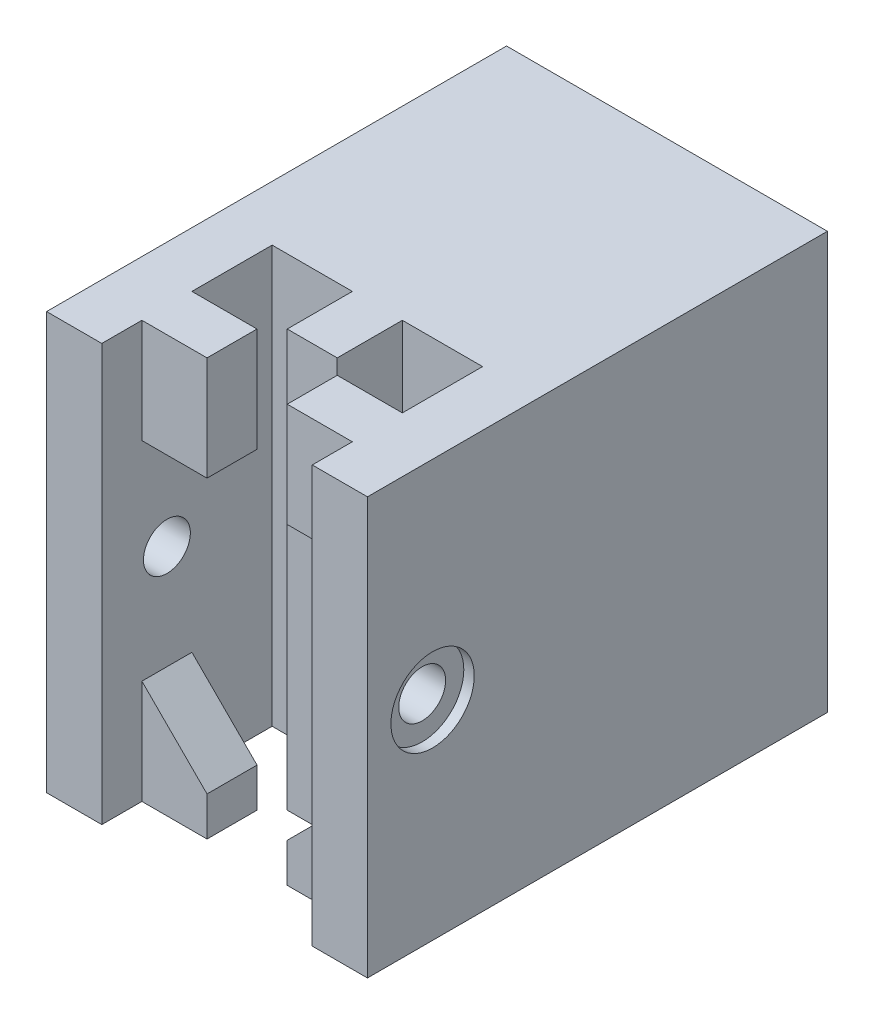
ISO-10303-21;
HEADER;
FILE_DESCRIPTION(('STEP AP214'),'2;1');
FILE_NAME('part.step','',(''),(''),'','','');
FILE_SCHEMA(('AUTOMOTIVE_DESIGN { 1 0 10303 214 1 1 1 1 }'));
ENDSEC;
DATA;
#1=APPLICATION_CONTEXT('core data for automotive mechanical design processes');
#2=APPLICATION_PROTOCOL_DEFINITION('international standard','automotive_design',2000,#1);
#3=PRODUCT_CONTEXT('',#1,'mechanical');
#4=PRODUCT('Part','Part','',(#3));
#5=PRODUCT_RELATED_PRODUCT_CATEGORY('part','',(#4));
#6=PRODUCT_DEFINITION_FORMATION('','',#4);
#7=PRODUCT_DEFINITION_CONTEXT('part definition',#1,'design');
#8=PRODUCT_DEFINITION('design','',#6,#7);
#9=PRODUCT_DEFINITION_SHAPE('','',#8);
#10=(LENGTH_UNIT() NAMED_UNIT(*) SI_UNIT(.MILLI.,.METRE.));
#11=(NAMED_UNIT(*) PLANE_ANGLE_UNIT() SI_UNIT($,.RADIAN.));
#12=(NAMED_UNIT(*) SI_UNIT($,.STERADIAN.) SOLID_ANGLE_UNIT());
#13=UNCERTAINTY_MEASURE_WITH_UNIT(LENGTH_MEASURE(1.E-05),#10,'distance_accuracy_value','');
#14=(GEOMETRIC_REPRESENTATION_CONTEXT(3) GLOBAL_UNCERTAINTY_ASSIGNED_CONTEXT((#13)) GLOBAL_UNIT_ASSIGNED_CONTEXT((#10,
#11,#12)) REPRESENTATION_CONTEXT('',''));
#15=CARTESIAN_POINT('',(0.,0.,0.));
#16=DIRECTION('',(0.,0.,1.));
#17=DIRECTION('',(1.,0.,0.));
#18=AXIS2_PLACEMENT_3D('',#15,#16,#17);
#19=CARTESIAN_POINT('',(-3.85,20.,2.4));
#20=DIRECTION('',(0.,0.,-1.));
#21=DIRECTION('',(-1.,0.,0.));
#22=AXIS2_PLACEMENT_3D('',#19,#20,#21);
#23=PLANE('',#22);
#24=DIRECTION('',(0.,-1.,0.));
#25=VECTOR('',#24,1.);
#26=CARTESIAN_POINT('',(-3.85,20.,2.4));
#27=LINE('',#26,#25);
#28=CARTESIAN_POINT('',(-3.85,-16.25,2.4));
#29=VERTEX_POINT('',#28);
#30=CARTESIAN_POINT('',(-3.85,-20.,2.4));
#31=VERTEX_POINT('',#30);
#32=EDGE_CURVE('E484',#29,#31,#27,.T.);
#33=ORIENTED_EDGE('',*,*,#32,.F.);
#34=DIRECTION('',(0.707106781186547,-0.707106781186548,0.));
#35=VECTOR('',#34,1.);
#36=CARTESIAN_POINT('',(-3.85,-16.25,2.4));
#37=LINE('',#36,#35);
#38=CARTESIAN_POINT('',(-10.1,-10.,2.4));
#39=VERTEX_POINT('',#38);
#40=EDGE_CURVE('E46',#29,#39,#37,.F.);
#41=ORIENTED_EDGE('',*,*,#40,.T.);
#42=DIRECTION('',(0.,-1.,0.));
#43=VECTOR('',#42,1.);
#44=CARTESIAN_POINT('',(-10.1,20.,2.4));
#45=LINE('',#44,#43);
#46=CARTESIAN_POINT('',(-10.1,-20.,2.4));
#47=VERTEX_POINT('',#46);
#48=EDGE_CURVE('E382',#39,#47,#45,.T.);
#49=ORIENTED_EDGE('',*,*,#48,.T.);
#50=DIRECTION('',(1.,0.,0.));
#51=VECTOR('',#50,1.);
#52=CARTESIAN_POINT('',(-3.85,-20.,2.4));
#53=LINE('',#52,#51);
#54=EDGE_CURVE('E341',#47,#31,#53,.T.);
#55=ORIENTED_EDGE('',*,*,#54,.T.);
#56=EDGE_LOOP('',(#33,#41,#49,#55));
#57=FACE_BOUND('',#56,.T.);
#58=ADVANCED_FACE('F37',(#57),#23,.F.);
#59=CARTESIAN_POINT('',(-3.85,20.,2.4));
#60=DIRECTION('',(-1.,0.,0.));
#61=DIRECTION('',(0.,0.,1.));
#62=AXIS2_PLACEMENT_3D('',#59,#60,#61);
#63=PLANE('',#62);
#64=DIRECTION('',(0.,-1.,0.));
#65=VECTOR('',#64,1.);
#66=CARTESIAN_POINT('',(-3.85,20.,-2.4));
#67=LINE('',#66,#65);
#68=CARTESIAN_POINT('',(-3.85,-16.25,-2.4));
#69=VERTEX_POINT('',#68);
#70=CARTESIAN_POINT('',(-3.85,-20.,-2.4));
#71=VERTEX_POINT('',#70);
#72=EDGE_CURVE('E480',#69,#71,#67,.T.);
#73=ORIENTED_EDGE('',*,*,#72,.F.);
#74=DIRECTION('',(0.,0.,1.));
#75=VECTOR('',#74,1.);
#76=CARTESIAN_POINT('',(-3.85,-16.25,2.4));
#77=LINE('',#76,#75);
#78=EDGE_CURVE('E499',#69,#29,#77,.T.);
#79=ORIENTED_EDGE('',*,*,#78,.T.);
#80=ORIENTED_EDGE('',*,*,#32,.T.);
#81=DIRECTION('',(0.,0.,-1.));
#82=VECTOR('',#81,1.);
#83=CARTESIAN_POINT('',(-3.85,-20.,2.4));
#84=LINE('',#83,#82);
#85=EDGE_CURVE('E385',#31,#71,#84,.T.);
#86=ORIENTED_EDGE('',*,*,#85,.T.);
#87=EDGE_LOOP('',(#73,#79,#80,#86));
#88=FACE_BOUND('',#87,.T.);
#89=ADVANCED_FACE('F514',(#88),#63,.F.);
#90=CARTESIAN_POINT('',(-3.85,20.,-2.4));
#91=DIRECTION('',(0.,0.,1.));
#92=DIRECTION('',(1.,0.,0.));
#93=AXIS2_PLACEMENT_3D('',#90,#91,#92);
#94=PLANE('',#93);
#95=DIRECTION('',(0.,-1.,0.));
#96=VECTOR('',#95,1.);
#97=CARTESIAN_POINT('',(-10.1,20.,-2.4));
#98=LINE('',#97,#96);
#99=CARTESIAN_POINT('',(-10.1,-10.,-2.4));
#100=VERTEX_POINT('',#99);
#101=CARTESIAN_POINT('',(-10.1,-20.,-2.4));
#102=VERTEX_POINT('',#101);
#103=EDGE_CURVE('E476',#100,#102,#98,.T.);
#104=ORIENTED_EDGE('',*,*,#103,.F.);
#105=DIRECTION('',(-0.707106781186547,0.707106781186548,0.));
#106=VECTOR('',#105,1.);
#107=CARTESIAN_POINT('',(-3.85,-16.25,-2.4));
#108=LINE('',#107,#106);
#109=EDGE_CURVE('E11',#100,#69,#108,.F.);
#110=ORIENTED_EDGE('',*,*,#109,.T.);
#111=ORIENTED_EDGE('',*,*,#72,.T.);
#112=DIRECTION('',(-1.,0.,0.));
#113=VECTOR('',#112,1.);
#114=CARTESIAN_POINT('',(-3.85,-20.,-2.4));
#115=LINE('',#114,#113);
#116=EDGE_CURVE('E388',#71,#102,#115,.T.);
#117=ORIENTED_EDGE('',*,*,#116,.T.);
#118=EDGE_LOOP('',(#104,#110,#111,#117));
#119=FACE_BOUND('',#118,.T.);
#120=ADVANCED_FACE('F512',(#119),#94,.F.);
#121=CARTESIAN_POINT('',(3.85,20.,-2.4));
#122=DIRECTION('',(0.,0.,1.));
#123=DIRECTION('',(1.,0.,0.));
#124=AXIS2_PLACEMENT_3D('',#121,#122,#123);
#125=PLANE('',#124);
#126=DIRECTION('',(0.,-1.,0.));
#127=VECTOR('',#126,1.);
#128=CARTESIAN_POINT('',(3.85,20.,-2.4));
#129=LINE('',#128,#127);
#130=CARTESIAN_POINT('',(3.85,-16.25,-2.4));
#131=VERTEX_POINT('',#130);
#132=CARTESIAN_POINT('',(3.85,-20.,-2.4));
#133=VERTEX_POINT('',#132);
#134=EDGE_CURVE('E450',#131,#133,#129,.T.);
#135=ORIENTED_EDGE('',*,*,#134,.F.);
#136=DIRECTION('',(-0.707106781186549,-0.707106781186546,0.));
#137=VECTOR('',#136,1.);
#138=CARTESIAN_POINT('',(3.85,-16.25,-2.4));
#139=LINE('',#138,#137);
#140=CARTESIAN_POINT('',(10.1,-10.,-2.4));
#141=VERTEX_POINT('',#140);
#142=EDGE_CURVE('E495',#131,#141,#139,.F.);
#143=ORIENTED_EDGE('',*,*,#142,.T.);
#144=DIRECTION('',(0.,-1.,0.));
#145=VECTOR('',#144,1.);
#146=CARTESIAN_POINT('',(10.1,20.,-2.4));
#147=LINE('',#146,#145);
#148=CARTESIAN_POINT('',(10.1,-20.,-2.4));
#149=VERTEX_POINT('',#148);
#150=EDGE_CURVE('E454',#141,#149,#147,.T.);
#151=ORIENTED_EDGE('',*,*,#150,.T.);
#152=DIRECTION('',(-1.,0.,0.));
#153=VECTOR('',#152,1.);
#154=CARTESIAN_POINT('',(3.85,-20.,-2.4));
#155=LINE('',#154,#153);
#156=EDGE_CURVE('E406',#149,#133,#155,.T.);
#157=ORIENTED_EDGE('',*,*,#156,.T.);
#158=EDGE_LOOP('',(#135,#143,#151,#157));
#159=FACE_BOUND('',#158,.T.);
#160=ADVANCED_FACE('F598',(#159),#125,.F.);
#161=CARTESIAN_POINT('',(3.85,20.,2.4));
#162=DIRECTION('',(1.,0.,0.));
#163=DIRECTION('',(0.,0.,-1.));
#164=AXIS2_PLACEMENT_3D('',#161,#162,#163);
#165=PLANE('',#164);
#166=DIRECTION('',(0.,-1.,0.));
#167=VECTOR('',#166,1.);
#168=CARTESIAN_POINT('',(3.85,20.,2.4));
#169=LINE('',#168,#167);
#170=CARTESIAN_POINT('',(3.85,-16.25,2.4));
#171=VERTEX_POINT('',#170);
#172=CARTESIAN_POINT('',(3.85,-20.,2.4));
#173=VERTEX_POINT('',#172);
#174=EDGE_CURVE('E446',#171,#173,#169,.T.);
#175=ORIENTED_EDGE('',*,*,#174,.F.);
#176=DIRECTION('',(0.,0.,-1.));
#177=VECTOR('',#176,1.);
#178=CARTESIAN_POINT('',(3.85,-16.25,2.4));
#179=LINE('',#178,#177);
#180=EDGE_CURVE('E488',#171,#131,#179,.T.);
#181=ORIENTED_EDGE('',*,*,#180,.T.);
#182=ORIENTED_EDGE('',*,*,#134,.T.);
#183=DIRECTION('',(0.,0.,1.));
#184=VECTOR('',#183,1.);
#185=CARTESIAN_POINT('',(3.85,-20.,2.4));
#186=LINE('',#185,#184);
#187=EDGE_CURVE('E409',#133,#173,#186,.T.);
#188=ORIENTED_EDGE('',*,*,#187,.T.);
#189=EDGE_LOOP('',(#175,#181,#182,#188));
#190=FACE_BOUND('',#189,.T.);
#191=ADVANCED_FACE('F594',(#190),#165,.F.);
#192=CARTESIAN_POINT('',(3.85,20.,2.4));
#193=DIRECTION('',(0.,0.,-1.));
#194=DIRECTION('',(-1.,0.,0.));
#195=AXIS2_PLACEMENT_3D('',#192,#193,#194);
#196=PLANE('',#195);
#197=DIRECTION('',(0.,-1.,0.));
#198=VECTOR('',#197,1.);
#199=CARTESIAN_POINT('',(10.1,20.,2.4));
#200=LINE('',#199,#198);
#201=CARTESIAN_POINT('',(10.1,-10.,2.4));
#202=VERTEX_POINT('',#201);
#203=CARTESIAN_POINT('',(10.1,-20.,2.4));
#204=VERTEX_POINT('',#203);
#205=EDGE_CURVE('E442',#202,#204,#200,.T.);
#206=ORIENTED_EDGE('',*,*,#205,.F.);
#207=DIRECTION('',(0.707106781186549,0.707106781186546,0.));
#208=VECTOR('',#207,1.);
#209=CARTESIAN_POINT('',(3.85,-16.25,2.4));
#210=LINE('',#209,#208);
#211=EDGE_CURVE('E497',#202,#171,#210,.F.);
#212=ORIENTED_EDGE('',*,*,#211,.T.);
#213=ORIENTED_EDGE('',*,*,#174,.T.);
#214=DIRECTION('',(1.,0.,0.));
#215=VECTOR('',#214,1.);
#216=CARTESIAN_POINT('',(3.85,-20.,2.4));
#217=LINE('',#216,#215);
#218=EDGE_CURVE('E412',#173,#204,#217,.T.);
#219=ORIENTED_EDGE('',*,*,#218,.T.);
#220=EDGE_LOOP('',(#206,#212,#213,#219));
#221=FACE_BOUND('',#220,.T.);
#222=ADVANCED_FACE('F588',(#221),#196,.F.);
#223=CARTESIAN_POINT('',(-10.1,20.,2.4));
#224=VERTEX_POINT('',#223);
#225=CARTESIAN_POINT('',(-10.1,10.,2.4));
#226=VERTEX_POINT('',#225);
#227=EDGE_CURVE('E427',#224,#226,#45,.T.);
#228=ORIENTED_EDGE('',*,*,#227,.T.);
#229=DIRECTION('',(1.,0.,0.));
#230=VECTOR('',#229,1.);
#231=CARTESIAN_POINT('',(-3.85,10.,2.4));
#232=LINE('',#231,#230);
#233=CARTESIAN_POINT('',(-3.85,10.,2.4));
#234=VERTEX_POINT('',#233);
#235=EDGE_CURVE('E320',#226,#234,#232,.T.);
#236=ORIENTED_EDGE('',*,*,#235,.T.);
#237=CARTESIAN_POINT('',(-3.85,20.,2.4));
#238=VERTEX_POINT('',#237);
#239=EDGE_CURVE('E485',#238,#234,#27,.T.);
#240=ORIENTED_EDGE('',*,*,#239,.F.);
#241=DIRECTION('',(1.,0.,0.));
#242=VECTOR('',#241,1.);
#243=CARTESIAN_POINT('',(-3.85,20.,2.4));
#244=LINE('',#243,#242);
#245=EDGE_CURVE('E342',#224,#238,#244,.T.);
#246=ORIENTED_EDGE('',*,*,#245,.F.);
#247=EDGE_LOOP('',(#228,#236,#240,#246));
#248=FACE_BOUND('',#247,.T.);
#249=ADVANCED_FACE('F545',(#248),#23,.F.);
#250=ORIENTED_EDGE('',*,*,#239,.T.);
#251=DIRECTION('',(0.,0.,-1.));
#252=VECTOR('',#251,1.);
#253=CARTESIAN_POINT('',(-3.85,10.,2.4));
#254=LINE('',#253,#252);
#255=CARTESIAN_POINT('',(-3.85,10.,-2.4));
#256=VERTEX_POINT('',#255);
#257=EDGE_CURVE('E317',#234,#256,#254,.T.);
#258=ORIENTED_EDGE('',*,*,#257,.T.);
#259=CARTESIAN_POINT('',(-3.85,20.,-2.4));
#260=VERTEX_POINT('',#259);
#261=EDGE_CURVE('E481',#260,#256,#67,.T.);
#262=ORIENTED_EDGE('',*,*,#261,.F.);
#263=DIRECTION('',(0.,0.,-1.));
#264=VECTOR('',#263,1.);
#265=CARTESIAN_POINT('',(-3.85,20.,2.4));
#266=LINE('',#265,#264);
#267=EDGE_CURVE('E345',#238,#260,#266,.T.);
#268=ORIENTED_EDGE('',*,*,#267,.F.);
#269=EDGE_LOOP('',(#250,#258,#262,#268));
#270=FACE_BOUND('',#269,.T.);
#271=ADVANCED_FACE('F541',(#270),#63,.F.);
#272=ORIENTED_EDGE('',*,*,#261,.T.);
#273=DIRECTION('',(-1.,0.,0.));
#274=VECTOR('',#273,1.);
#275=CARTESIAN_POINT('',(-3.85,10.,-2.4));
#276=LINE('',#275,#274);
#277=CARTESIAN_POINT('',(-10.1,10.,-2.4));
#278=VERTEX_POINT('',#277);
#279=EDGE_CURVE('E314',#256,#278,#276,.T.);
#280=ORIENTED_EDGE('',*,*,#279,.T.);
#281=CARTESIAN_POINT('',(-10.1,20.,-2.4));
#282=VERTEX_POINT('',#281);
#283=EDGE_CURVE('E477',#282,#278,#98,.T.);
#284=ORIENTED_EDGE('',*,*,#283,.F.);
#285=DIRECTION('',(-1.,0.,0.));
#286=VECTOR('',#285,1.);
#287=CARTESIAN_POINT('',(-3.85,20.,-2.4));
#288=LINE('',#287,#286);
#289=EDGE_CURVE('E348',#260,#282,#288,.T.);
#290=ORIENTED_EDGE('',*,*,#289,.F.);
#291=EDGE_LOOP('',(#272,#280,#284,#290));
#292=FACE_BOUND('',#291,.T.);
#293=ADVANCED_FACE('F536',(#292),#94,.F.);
#294=CARTESIAN_POINT('',(-10.1,20.,-10.1));
#295=DIRECTION('',(0.,0.,-1.));
#296=DIRECTION('',(-1.,0.,0.));
#297=AXIS2_PLACEMENT_3D('',#294,#295,#296);
#298=PLANE('',#297);
#299=DIRECTION('',(1.,0.,0.));
#300=VECTOR('',#299,1.);
#301=CARTESIAN_POINT('',(-10.1,-20.,-10.1));
#302=LINE('',#301,#300);
#303=CARTESIAN_POINT('',(-10.1,-20.,-10.1));
#304=VERTEX_POINT('',#303);
#305=CARTESIAN_POINT('',(-2.4,-20.,-10.1));
#306=VERTEX_POINT('',#305);
#307=EDGE_CURVE('E393',#304,#306,#302,.T.);
#308=ORIENTED_EDGE('',*,*,#307,.T.);
#309=DIRECTION('',(0.,-1.,0.));
#310=VECTOR('',#309,1.);
#311=CARTESIAN_POINT('',(-2.4,20.,-10.1));
#312=LINE('',#311,#310);
#313=CARTESIAN_POINT('',(-2.4,20.,-10.1));
#314=VERTEX_POINT('',#313);
#315=EDGE_CURVE('E470',#314,#306,#312,.T.);
#316=ORIENTED_EDGE('',*,*,#315,.F.);
#317=DIRECTION('',(1.,0.,0.));
#318=VECTOR('',#317,1.);
#319=CARTESIAN_POINT('',(-10.1,20.,-10.1));
#320=LINE('',#319,#318);
#321=CARTESIAN_POINT('',(-10.1,20.,-10.1));
#322=VERTEX_POINT('',#321);
#323=EDGE_CURVE('E352',#322,#314,#320,.T.);
#324=ORIENTED_EDGE('',*,*,#323,.F.);
#325=DIRECTION('',(0.,-1.,0.));
#326=VECTOR('',#325,1.);
#327=CARTESIAN_POINT('',(-10.1,20.,-10.1));
#328=LINE('',#327,#326);
#329=EDGE_CURVE('E473',#322,#304,#328,.T.);
#330=ORIENTED_EDGE('',*,*,#329,.T.);
#331=EDGE_LOOP('',(#308,#316,#324,#330));
#332=FACE_BOUND('',#331,.T.);
#333=ADVANCED_FACE('F526',(#332),#298,.F.);
#334=CARTESIAN_POINT('',(-2.4,20.,-10.1));
#335=DIRECTION('',(1.,0.,0.));
#336=DIRECTION('',(0.,0.,-1.));
#337=AXIS2_PLACEMENT_3D('',#334,#335,#336);
#338=PLANE('',#337);
#339=DIRECTION('',(0.,0.,1.));
#340=VECTOR('',#339,1.);
#341=CARTESIAN_POINT('',(-2.4,-20.,-10.1));
#342=LINE('',#341,#340);
#343=CARTESIAN_POINT('',(-2.4,-20.,-3.85));
#344=VERTEX_POINT('',#343);
#345=EDGE_CURVE('E395',#306,#344,#342,.T.);
#346=ORIENTED_EDGE('',*,*,#345,.T.);
#347=DIRECTION('',(0.,-1.,0.));
#348=VECTOR('',#347,1.);
#349=CARTESIAN_POINT('',(-2.4,20.,-3.85));
#350=LINE('',#349,#348);
#351=CARTESIAN_POINT('',(-2.4,20.,-3.85));
#352=VERTEX_POINT('',#351);
#353=EDGE_CURVE('E467',#352,#344,#350,.T.);
#354=ORIENTED_EDGE('',*,*,#353,.F.);
#355=DIRECTION('',(0.,0.,1.));
#356=VECTOR('',#355,1.);
#357=CARTESIAN_POINT('',(-2.4,20.,-10.1));
#358=LINE('',#357,#356);
#359=EDGE_CURVE('E354',#314,#352,#358,.T.);
#360=ORIENTED_EDGE('',*,*,#359,.F.);
#361=ORIENTED_EDGE('',*,*,#315,.T.);
#362=EDGE_LOOP('',(#346,#354,#360,#361));
#363=FACE_BOUND('',#362,.T.);
#364=ADVANCED_FACE('F616',(#363),#338,.F.);
#365=CARTESIAN_POINT('',(-2.4,20.,-3.85));
#366=DIRECTION('',(0.,0.,-1.));
#367=DIRECTION('',(-1.,0.,0.));
#368=AXIS2_PLACEMENT_3D('',#365,#366,#367);
#369=PLANE('',#368);
#370=DIRECTION('',(1.,0.,0.));
#371=VECTOR('',#370,1.);
#372=CARTESIAN_POINT('',(-2.4,-20.,-3.85));
#373=LINE('',#372,#371);
#374=CARTESIAN_POINT('',(2.4,-20.,-3.85));
#375=VERTEX_POINT('',#374);
#376=EDGE_CURVE('E397',#344,#375,#373,.T.);
#377=ORIENTED_EDGE('',*,*,#376,.T.);
#378=DIRECTION('',(0.,-1.,0.));
#379=VECTOR('',#378,1.);
#380=CARTESIAN_POINT('',(2.4,20.,-3.85));
#381=LINE('',#380,#379);
#382=CARTESIAN_POINT('',(2.4,20.,-3.85));
#383=VERTEX_POINT('',#382);
#384=EDGE_CURVE('E464',#383,#375,#381,.T.);
#385=ORIENTED_EDGE('',*,*,#384,.F.);
#386=DIRECTION('',(1.,0.,0.));
#387=VECTOR('',#386,1.);
#388=CARTESIAN_POINT('',(-2.4,20.,-3.85));
#389=LINE('',#388,#387);
#390=EDGE_CURVE('E356',#352,#383,#389,.T.);
#391=ORIENTED_EDGE('',*,*,#390,.F.);
#392=ORIENTED_EDGE('',*,*,#353,.T.);
#393=EDGE_LOOP('',(#377,#385,#391,#392));
#394=FACE_BOUND('',#393,.T.);
#395=ADVANCED_FACE('F614',(#394),#369,.F.);
#396=CARTESIAN_POINT('',(2.4,20.,-10.1));
#397=DIRECTION('',(-1.,0.,0.));
#398=DIRECTION('',(0.,0.,1.));
#399=AXIS2_PLACEMENT_3D('',#396,#397,#398);
#400=PLANE('',#399);
#401=DIRECTION('',(0.,0.,-1.));
#402=VECTOR('',#401,1.);
#403=CARTESIAN_POINT('',(2.4,-20.,-10.1));
#404=LINE('',#403,#402);
#405=CARTESIAN_POINT('',(2.4,-20.,-10.1));
#406=VERTEX_POINT('',#405);
#407=EDGE_CURVE('E399',#375,#406,#404,.T.);
#408=ORIENTED_EDGE('',*,*,#407,.T.);
#409=DIRECTION('',(0.,-1.,0.));
#410=VECTOR('',#409,1.);
#411=CARTESIAN_POINT('',(2.4,20.,-10.1));
#412=LINE('',#411,#410);
#413=CARTESIAN_POINT('',(2.4,20.,-10.1));
#414=VERTEX_POINT('',#413);
#415=EDGE_CURVE('E461',#414,#406,#412,.T.);
#416=ORIENTED_EDGE('',*,*,#415,.F.);
#417=DIRECTION('',(0.,0.,-1.));
#418=VECTOR('',#417,1.);
#419=CARTESIAN_POINT('',(2.4,20.,-10.1));
#420=LINE('',#419,#418);
#421=EDGE_CURVE('E358',#383,#414,#420,.T.);
#422=ORIENTED_EDGE('',*,*,#421,.F.);
#423=ORIENTED_EDGE('',*,*,#384,.T.);
#424=EDGE_LOOP('',(#408,#416,#422,#423));
#425=FACE_BOUND('',#424,.T.);
#426=ADVANCED_FACE('F610',(#425),#400,.F.);
#427=CARTESIAN_POINT('',(10.1,20.,-10.1));
#428=DIRECTION('',(0.,0.,-1.));
#429=DIRECTION('',(-1.,0.,0.));
#430=AXIS2_PLACEMENT_3D('',#427,#428,#429);
#431=PLANE('',#430);
#432=DIRECTION('',(1.,0.,0.));
#433=VECTOR('',#432,1.);
#434=CARTESIAN_POINT('',(10.1,-20.,-10.1));
#435=LINE('',#434,#433);
#436=CARTESIAN_POINT('',(10.1,-20.,-10.1));
#437=VERTEX_POINT('',#436);
#438=EDGE_CURVE('E401',#406,#437,#435,.T.);
#439=ORIENTED_EDGE('',*,*,#438,.T.);
#440=DIRECTION('',(0.,-1.,0.));
#441=VECTOR('',#440,1.);
#442=CARTESIAN_POINT('',(10.1,20.,-10.1));
#443=LINE('',#442,#441);
#444=CARTESIAN_POINT('',(10.1,20.,-10.1));
#445=VERTEX_POINT('',#444);
#446=EDGE_CURVE('E458',#445,#437,#443,.T.);
#447=ORIENTED_EDGE('',*,*,#446,.F.);
#448=DIRECTION('',(1.,0.,0.));
#449=VECTOR('',#448,1.);
#450=CARTESIAN_POINT('',(10.1,20.,-10.1));
#451=LINE('',#450,#449);
#452=EDGE_CURVE('E360',#414,#445,#451,.T.);
#453=ORIENTED_EDGE('',*,*,#452,.F.);
#454=ORIENTED_EDGE('',*,*,#415,.T.);
#455=EDGE_LOOP('',(#439,#447,#453,#454));
#456=FACE_BOUND('',#455,.T.);
#457=ADVANCED_FACE('F605',(#456),#431,.F.);
#458=CARTESIAN_POINT('',(10.1,20.,-2.4));
#459=VERTEX_POINT('',#458);
#460=CARTESIAN_POINT('',(10.1,10.,-2.4));
#461=VERTEX_POINT('',#460);
#462=EDGE_CURVE('E455',#459,#461,#147,.T.);
#463=ORIENTED_EDGE('',*,*,#462,.T.);
#464=DIRECTION('',(-1.,0.,0.));
#465=VECTOR('',#464,1.);
#466=CARTESIAN_POINT('',(3.85,10.,-2.4));
#467=LINE('',#466,#465);
#468=CARTESIAN_POINT('',(3.85,10.,-2.4));
#469=VERTEX_POINT('',#468);
#470=EDGE_CURVE('E311',#461,#469,#467,.T.);
#471=ORIENTED_EDGE('',*,*,#470,.T.);
#472=CARTESIAN_POINT('',(3.85,20.,-2.4));
#473=VERTEX_POINT('',#472);
#474=EDGE_CURVE('E451',#473,#469,#129,.T.);
#475=ORIENTED_EDGE('',*,*,#474,.F.);
#476=DIRECTION('',(-1.,0.,0.));
#477=VECTOR('',#476,1.);
#478=CARTESIAN_POINT('',(3.85,20.,-2.4));
#479=LINE('',#478,#477);
#480=EDGE_CURVE('E364',#459,#473,#479,.T.);
#481=ORIENTED_EDGE('',*,*,#480,.F.);
#482=EDGE_LOOP('',(#463,#471,#475,#481));
#483=FACE_BOUND('',#482,.T.);
#484=ADVANCED_FACE('F650',(#483),#125,.F.);
#485=ORIENTED_EDGE('',*,*,#474,.T.);
#486=DIRECTION('',(0.,0.,1.));
#487=VECTOR('',#486,1.);
#488=CARTESIAN_POINT('',(3.85,10.,2.4));
#489=LINE('',#488,#487);
#490=CARTESIAN_POINT('',(3.85,10.,2.4));
#491=VERTEX_POINT('',#490);
#492=EDGE_CURVE('E307',#469,#491,#489,.T.);
#493=ORIENTED_EDGE('',*,*,#492,.T.);
#494=CARTESIAN_POINT('',(3.85,20.,2.4));
#495=VERTEX_POINT('',#494);
#496=EDGE_CURVE('E447',#495,#491,#169,.T.);
#497=ORIENTED_EDGE('',*,*,#496,.F.);
#498=DIRECTION('',(0.,0.,1.));
#499=VECTOR('',#498,1.);
#500=CARTESIAN_POINT('',(3.85,20.,2.4));
#501=LINE('',#500,#499);
#502=EDGE_CURVE('E366',#473,#495,#501,.T.);
#503=ORIENTED_EDGE('',*,*,#502,.F.);
#504=EDGE_LOOP('',(#485,#493,#497,#503));
#505=FACE_BOUND('',#504,.T.);
#506=ADVANCED_FACE('F642',(#505),#165,.F.);
#507=ORIENTED_EDGE('',*,*,#496,.T.);
#508=DIRECTION('',(1.,0.,0.));
#509=VECTOR('',#508,1.);
#510=CARTESIAN_POINT('',(3.85,10.,2.4));
#511=LINE('',#510,#509);
#512=CARTESIAN_POINT('',(10.1,10.,2.4));
#513=VERTEX_POINT('',#512);
#514=EDGE_CURVE('E304',#491,#513,#511,.T.);
#515=ORIENTED_EDGE('',*,*,#514,.T.);
#516=CARTESIAN_POINT('',(10.1,20.,2.4));
#517=VERTEX_POINT('',#516);
#518=EDGE_CURVE('E443',#517,#513,#200,.T.);
#519=ORIENTED_EDGE('',*,*,#518,.F.);
#520=DIRECTION('',(1.,0.,0.));
#521=VECTOR('',#520,1.);
#522=CARTESIAN_POINT('',(3.85,20.,2.4));
#523=LINE('',#522,#521);
#524=EDGE_CURVE('E368',#495,#517,#523,.T.);
#525=ORIENTED_EDGE('',*,*,#524,.F.);
#526=EDGE_LOOP('',(#507,#515,#519,#525));
#527=FACE_BOUND('',#526,.T.);
#528=ADVANCED_FACE('F637',(#527),#196,.F.);
#529=CARTESIAN_POINT('',(10.1,20.,2.4));
#530=DIRECTION('',(1.,0.,0.));
#531=DIRECTION('',(0.,0.,-1.));
#532=AXIS2_PLACEMENT_3D('',#529,#530,#531);
#533=PLANE('',#532);
#534=DIRECTION('',(0.,0.,1.));
#535=VECTOR('',#534,1.);
#536=CARTESIAN_POINT('',(10.1,10.,-3.));
#537=LINE('',#536,#535);
#538=EDGE_CURVE('E294',#461,#513,#537,.T.);
#539=ORIENTED_EDGE('',*,*,#538,.F.);
#540=ORIENTED_EDGE('',*,*,#462,.F.);
#541=DIRECTION('',(0.,0.,1.));
#542=VECTOR('',#541,1.);
#543=CARTESIAN_POINT('',(10.1,20.,-2.4));
#544=LINE('',#543,#542);
#545=EDGE_CURVE('E362',#445,#459,#544,.T.);
#546=ORIENTED_EDGE('',*,*,#545,.F.);
#547=ORIENTED_EDGE('',*,*,#446,.T.);
#548=DIRECTION('',(0.,0.,1.));
#549=VECTOR('',#548,1.);
#550=CARTESIAN_POINT('',(10.1,-20.,-2.4));
#551=LINE('',#550,#549);
#552=EDGE_CURVE('E403',#437,#149,#551,.T.);
#553=ORIENTED_EDGE('',*,*,#552,.T.);
#554=ORIENTED_EDGE('',*,*,#150,.F.);
#555=DIRECTION('',(0.,0.,1.));
#556=VECTOR('',#555,1.);
#557=CARTESIAN_POINT('',(10.1,-10.,-3.));
#558=LINE('',#557,#556);
#559=EDGE_CURVE('E295',#141,#202,#558,.T.);
#560=ORIENTED_EDGE('',*,*,#559,.T.);
#561=ORIENTED_EDGE('',*,*,#205,.T.);
#562=DIRECTION('',(0.,0.,1.));
#563=VECTOR('',#562,1.);
#564=CARTESIAN_POINT('',(10.1,-20.,2.4));
#565=LINE('',#564,#563);
#566=CARTESIAN_POINT('',(10.1,-20.,6.25));
#567=VERTEX_POINT('',#566);
#568=EDGE_CURVE('E415',#204,#567,#565,.T.);
#569=ORIENTED_EDGE('',*,*,#568,.T.);
#570=DIRECTION('',(0.,-1.,0.));
#571=VECTOR('',#570,1.);
#572=CARTESIAN_POINT('',(10.1,20.,6.25));
#573=LINE('',#572,#571);
#574=CARTESIAN_POINT('',(10.1,20.,6.25));
#575=VERTEX_POINT('',#574);
#576=EDGE_CURVE('E439',#575,#567,#573,.T.);
#577=ORIENTED_EDGE('',*,*,#576,.F.);
#578=DIRECTION('',(0.,0.,1.));
#579=VECTOR('',#578,1.);
#580=CARTESIAN_POINT('',(10.1,20.,2.4));
#581=LINE('',#580,#579);
#582=EDGE_CURVE('E370',#517,#575,#581,.T.);
#583=ORIENTED_EDGE('',*,*,#582,.F.);
#584=ORIENTED_EDGE('',*,*,#518,.T.);
#585=EDGE_LOOP('',(#539,#540,#546,#547,#553,#554,#560,#561,#569,#577,#583,#584));
#586=FACE_BOUND('',#585,.T.);
#587=CARTESIAN_POINT('',(10.1,0.,0.));
#588=DIRECTION('',(1.,0.,0.));
#589=DIRECTION('',(0.,0.,-1.));
#590=AXIS2_PLACEMENT_3D('',#587,#588,#589);
#591=CIRCLE('',#590,2.25000000000001);
#592=CARTESIAN_POINT('',(10.1,0.,-2.25000000000001));
#593=VERTEX_POINT('',#592);
#594=EDGE_CURVE('E308',#593,#593,#591,.F.);
#595=ORIENTED_EDGE('',*,*,#594,.F.);
#596=EDGE_LOOP('',(#595));
#597=FACE_BOUND('',#596,.T.);
#598=ADVANCED_FACE('F581',(#586,#597),#533,.F.);
#599=CARTESIAN_POINT('',(10.1,20.,6.25));
#600=DIRECTION('',(0.,0.,-1.));
#601=DIRECTION('',(-1.,0.,0.));
#602=AXIS2_PLACEMENT_3D('',#599,#600,#601);
#603=PLANE('',#602);
#604=DIRECTION('',(1.,0.,0.));
#605=VECTOR('',#604,1.);
#606=CARTESIAN_POINT('',(10.1,-20.,6.25));
#607=LINE('',#606,#605);
#608=CARTESIAN_POINT('',(15.4,-20.,6.25));
#609=VERTEX_POINT('',#608);
#610=EDGE_CURVE('E417',#567,#609,#607,.T.);
#611=ORIENTED_EDGE('',*,*,#610,.T.);
#612=DIRECTION('',(0.,-1.,0.));
#613=VECTOR('',#612,1.);
#614=CARTESIAN_POINT('',(15.4,20.,6.25));
#615=LINE('',#614,#613);
#616=CARTESIAN_POINT('',(15.4,20.,6.25));
#617=VERTEX_POINT('',#616);
#618=EDGE_CURVE('E436',#617,#609,#615,.T.);
#619=ORIENTED_EDGE('',*,*,#618,.F.);
#620=DIRECTION('',(1.,0.,0.));
#621=VECTOR('',#620,1.);
#622=CARTESIAN_POINT('',(10.1,20.,6.25));
#623=LINE('',#622,#621);
#624=EDGE_CURVE('E372',#575,#617,#623,.T.);
#625=ORIENTED_EDGE('',*,*,#624,.F.);
#626=ORIENTED_EDGE('',*,*,#576,.T.);
#627=EDGE_LOOP('',(#611,#619,#625,#626));
#628=FACE_BOUND('',#627,.T.);
#629=ADVANCED_FACE('F576',(#628),#603,.F.);
#630=CARTESIAN_POINT('',(15.4,20.,-15.4));
#631=DIRECTION('',(-1.,0.,0.));
#632=DIRECTION('',(0.,0.,1.));
#633=AXIS2_PLACEMENT_3D('',#630,#631,#632);
#634=PLANE('',#633);
#635=CARTESIAN_POINT('',(15.4,0.,0.));
#636=DIRECTION('',(1.,0.,0.));
#637=DIRECTION('',(0.,0.,-1.));
#638=AXIS2_PLACEMENT_3D('',#635,#636,#637);
#639=CIRCLE('',#638,3.99999999999999);
#640=CARTESIAN_POINT('',(15.4,0.,-3.99999999999999));
#641=VERTEX_POINT('',#640);
#642=EDGE_CURVE('E332',#641,#641,#639,.T.);
#643=ORIENTED_EDGE('',*,*,#642,.F.);
#644=EDGE_LOOP('',(#643));
#645=FACE_BOUND('',#644,.T.);
#646=DIRECTION('',(0.,0.,-1.));
#647=VECTOR('',#646,1.);
#648=CARTESIAN_POINT('',(15.4,-20.,-15.4));
#649=LINE('',#648,#647);
#650=CARTESIAN_POINT('',(15.4,-20.,-37.9));
#651=VERTEX_POINT('',#650);
#652=EDGE_CURVE('E419',#609,#651,#649,.T.);
#653=ORIENTED_EDGE('',*,*,#652,.T.);
#654=DIRECTION('',(0.,-1.,0.));
#655=VECTOR('',#654,1.);
#656=CARTESIAN_POINT('',(15.4,20.,-37.9));
#657=LINE('',#656,#655);
#658=CARTESIAN_POINT('',(15.4,20.,-37.9));
#659=VERTEX_POINT('',#658);
#660=EDGE_CURVE('E277',#659,#651,#657,.T.);
#661=ORIENTED_EDGE('',*,*,#660,.F.);
#662=DIRECTION('',(0.,0.,-1.));
#663=VECTOR('',#662,1.);
#664=CARTESIAN_POINT('',(15.4,20.,-15.4));
#665=LINE('',#664,#663);
#666=EDGE_CURVE('E374',#617,#659,#665,.T.);
#667=ORIENTED_EDGE('',*,*,#666,.F.);
#668=ORIENTED_EDGE('',*,*,#618,.T.);
#669=EDGE_LOOP('',(#653,#661,#667,#668));
#670=FACE_BOUND('',#669,.T.);
#671=ADVANCED_FACE('F571',(#645,#670),#634,.F.);
#672=CARTESIAN_POINT('',(-15.4,20.,-15.4));
#673=DIRECTION('',(1.,0.,0.));
#674=DIRECTION('',(0.,0.,-1.));
#675=AXIS2_PLACEMENT_3D('',#672,#673,#674);
#676=PLANE('',#675);
#677=CARTESIAN_POINT('',(-15.4,0.,0.));
#678=DIRECTION('',(-1.,0.,0.));
#679=DIRECTION('',(0.,0.,1.));
#680=AXIS2_PLACEMENT_3D('',#677,#678,#679);
#681=CIRCLE('',#680,3.99999999999999);
#682=CARTESIAN_POINT('',(-15.4,0.,3.99999999999999));
#683=VERTEX_POINT('',#682);
#684=EDGE_CURVE('E323',#683,#683,#681,.T.);
#685=ORIENTED_EDGE('',*,*,#684,.F.);
#686=EDGE_LOOP('',(#685));
#687=FACE_BOUND('',#686,.T.);
#688=DIRECTION('',(0.,1.,0.));
#689=VECTOR('',#688,1.);
#690=CARTESIAN_POINT('',(-15.4,15.,-17.9));
#691=LINE('',#690,#689);
#692=CARTESIAN_POINT('',(-15.4,-15.,-17.9));
#693=VERTEX_POINT('',#692);
#694=CARTESIAN_POINT('',(-15.4,15.,-17.9));
#695=VERTEX_POINT('',#694);
#696=EDGE_CURVE('E268',#693,#695,#691,.T.);
#697=ORIENTED_EDGE('',*,*,#696,.F.);
#698=DIRECTION('',(0.,-0.330350424728106,0.943858356366017));
#699=VECTOR('',#698,1.);
#700=CARTESIAN_POINT('',(-15.4,-15.,-17.9));
#701=LINE('',#700,#699);
#702=CARTESIAN_POINT('',(-15.4,-8.,-37.9));
#703=VERTEX_POINT('',#702);
#704=EDGE_CURVE('E253',#703,#693,#701,.T.);
#705=ORIENTED_EDGE('',*,*,#704,.F.);
#706=DIRECTION('',(0.,1.,0.));
#707=VECTOR('',#706,1.);
#708=CARTESIAN_POINT('',(-15.4,20.,-37.9));
#709=LINE('',#708,#707);
#710=CARTESIAN_POINT('',(-15.4,-20.,-37.9));
#711=VERTEX_POINT('',#710);
#712=EDGE_CURVE('E288',#711,#703,#709,.T.);
#713=ORIENTED_EDGE('',*,*,#712,.F.);
#714=DIRECTION('',(0.,0.,1.));
#715=VECTOR('',#714,1.);
#716=CARTESIAN_POINT('',(-15.4,-20.,-15.4));
#717=LINE('',#716,#715);
#718=CARTESIAN_POINT('',(-15.4,-20.,6.25));
#719=VERTEX_POINT('',#718);
#720=EDGE_CURVE('E421',#711,#719,#717,.T.);
#721=ORIENTED_EDGE('',*,*,#720,.T.);
#722=DIRECTION('',(0.,-1.,0.));
#723=VECTOR('',#722,1.);
#724=CARTESIAN_POINT('',(-15.4,20.,6.25));
#725=LINE('',#724,#723);
#726=CARTESIAN_POINT('',(-15.4,20.,6.25));
#727=VERTEX_POINT('',#726);
#728=EDGE_CURVE('E433',#727,#719,#725,.T.);
#729=ORIENTED_EDGE('',*,*,#728,.F.);
#730=DIRECTION('',(0.,0.,1.));
#731=VECTOR('',#730,1.);
#732=CARTESIAN_POINT('',(-15.4,20.,-15.4));
#733=LINE('',#732,#731);
#734=CARTESIAN_POINT('',(-15.4,20.,-37.9));
#735=VERTEX_POINT('',#734);
#736=EDGE_CURVE('E376',#735,#727,#733,.T.);
#737=ORIENTED_EDGE('',*,*,#736,.F.);
#738=CARTESIAN_POINT('',(-15.4,8.,-37.9));
#739=VERTEX_POINT('',#738);
#740=EDGE_CURVE('E287',#739,#735,#709,.T.);
#741=ORIENTED_EDGE('',*,*,#740,.F.);
#742=DIRECTION('',(0.,-0.330350424728106,-0.943858356366017));
#743=VECTOR('',#742,1.);
#744=CARTESIAN_POINT('',(-15.4,8.,-37.9));
#745=LINE('',#744,#743);
#746=EDGE_CURVE('E266',#695,#739,#745,.T.);
#747=ORIENTED_EDGE('',*,*,#746,.F.);
#748=EDGE_LOOP('',(#697,#705,#713,#721,#729,#737,#741,#747));
#749=FACE_BOUND('',#748,.T.);
#750=ADVANCED_FACE('F562',(#687,#749),#676,.F.);
#751=CARTESIAN_POINT('',(-10.1,20.,6.25));
#752=DIRECTION('',(0.,0.,-1.));
#753=DIRECTION('',(-1.,0.,0.));
#754=AXIS2_PLACEMENT_3D('',#751,#752,#753);
#755=PLANE('',#754);
#756=DIRECTION('',(1.,0.,0.));
#757=VECTOR('',#756,1.);
#758=CARTESIAN_POINT('',(-10.1,-20.,6.25));
#759=LINE('',#758,#757);
#760=CARTESIAN_POINT('',(-10.1,-20.,6.25));
#761=VERTEX_POINT('',#760);
#762=EDGE_CURVE('E423',#719,#761,#759,.T.);
#763=ORIENTED_EDGE('',*,*,#762,.T.);
#764=DIRECTION('',(0.,-1.,0.));
#765=VECTOR('',#764,1.);
#766=CARTESIAN_POINT('',(-10.1,20.,6.25));
#767=LINE('',#766,#765);
#768=CARTESIAN_POINT('',(-10.1,20.,6.25));
#769=VERTEX_POINT('',#768);
#770=EDGE_CURVE('E430',#769,#761,#767,.T.);
#771=ORIENTED_EDGE('',*,*,#770,.F.);
#772=DIRECTION('',(1.,0.,0.));
#773=VECTOR('',#772,1.);
#774=CARTESIAN_POINT('',(-10.1,20.,6.25));
#775=LINE('',#774,#773);
#776=EDGE_CURVE('E378',#727,#769,#775,.T.);
#777=ORIENTED_EDGE('',*,*,#776,.F.);
#778=ORIENTED_EDGE('',*,*,#728,.T.);
#779=EDGE_LOOP('',(#763,#771,#777,#778));
#780=FACE_BOUND('',#779,.T.);
#781=ADVANCED_FACE('F553',(#780),#755,.F.);
#782=CARTESIAN_POINT('',(-10.1,20.,2.4));
#783=DIRECTION('',(-1.,0.,0.));
#784=DIRECTION('',(0.,0.,1.));
#785=AXIS2_PLACEMENT_3D('',#782,#783,#784);
#786=PLANE('',#785);
#787=ORIENTED_EDGE('',*,*,#48,.F.);
#788=DIRECTION('',(0.,0.,1.));
#789=VECTOR('',#788,1.);
#790=CARTESIAN_POINT('',(-10.1,-10.,-3.));
#791=LINE('',#790,#789);
#792=EDGE_CURVE('E298',#100,#39,#791,.T.);
#793=ORIENTED_EDGE('',*,*,#792,.F.);
#794=ORIENTED_EDGE('',*,*,#103,.T.);
#795=DIRECTION('',(0.,0.,-1.));
#796=VECTOR('',#795,1.);
#797=CARTESIAN_POINT('',(-10.1,-20.,-2.4));
#798=LINE('',#797,#796);
#799=EDGE_CURVE('E391',#102,#304,#798,.T.);
#800=ORIENTED_EDGE('',*,*,#799,.T.);
#801=ORIENTED_EDGE('',*,*,#329,.F.);
#802=DIRECTION('',(0.,0.,-1.));
#803=VECTOR('',#802,1.);
#804=CARTESIAN_POINT('',(-10.1,20.,-2.4));
#805=LINE('',#804,#803);
#806=EDGE_CURVE('E350',#282,#322,#805,.T.);
#807=ORIENTED_EDGE('',*,*,#806,.F.);
#808=ORIENTED_EDGE('',*,*,#283,.T.);
#809=DIRECTION('',(0.,0.,1.));
#810=VECTOR('',#809,1.);
#811=CARTESIAN_POINT('',(-10.1,10.,-3.));
#812=LINE('',#811,#810);
#813=EDGE_CURVE('E300',#278,#226,#812,.T.);
#814=ORIENTED_EDGE('',*,*,#813,.T.);
#815=ORIENTED_EDGE('',*,*,#227,.F.);
#816=DIRECTION('',(0.,0.,-1.));
#817=VECTOR('',#816,1.);
#818=CARTESIAN_POINT('',(-10.1,20.,2.4));
#819=LINE('',#818,#817);
#820=EDGE_CURVE('E380',#769,#224,#819,.T.);
#821=ORIENTED_EDGE('',*,*,#820,.F.);
#822=ORIENTED_EDGE('',*,*,#770,.T.);
#823=DIRECTION('',(0.,0.,-1.));
#824=VECTOR('',#823,1.);
#825=CARTESIAN_POINT('',(-10.1,-20.,2.4));
#826=LINE('',#825,#824);
#827=EDGE_CURVE('E346',#761,#47,#826,.T.);
#828=ORIENTED_EDGE('',*,*,#827,.T.);
#829=EDGE_LOOP('',(#787,#793,#794,#800,#801,#807,#808,#814,#815,#821,#822,#828));
#830=FACE_BOUND('',#829,.T.);
#831=CARTESIAN_POINT('',(-10.1,0.,0.));
#832=DIRECTION('',(-1.,0.,0.));
#833=DIRECTION('',(0.,0.,1.));
#834=AXIS2_PLACEMENT_3D('',#831,#832,#833);
#835=CIRCLE('',#834,2.25000000000001);
#836=CARTESIAN_POINT('',(-10.1,0.,2.25000000000001));
#837=VERTEX_POINT('',#836);
#838=EDGE_CURVE('E297',#837,#837,#835,.F.);
#839=ORIENTED_EDGE('',*,*,#838,.F.);
#840=EDGE_LOOP('',(#839));
#841=FACE_BOUND('',#840,.T.);
#842=ADVANCED_FACE('F504',(#830,#841),#786,.F.);
#843=CARTESIAN_POINT('',(0.,20.,0.));
#844=DIRECTION('',(0.,1.,0.));
#845=DIRECTION('',(0.,0.,1.));
#846=AXIS2_PLACEMENT_3D('',#843,#844,#845);
#847=PLANE('',#846);
#848=ORIENTED_EDGE('',*,*,#245,.T.);
#849=ORIENTED_EDGE('',*,*,#267,.T.);
#850=ORIENTED_EDGE('',*,*,#289,.T.);
#851=ORIENTED_EDGE('',*,*,#806,.T.);
#852=ORIENTED_EDGE('',*,*,#323,.T.);
#853=ORIENTED_EDGE('',*,*,#359,.T.);
#854=ORIENTED_EDGE('',*,*,#390,.T.);
#855=ORIENTED_EDGE('',*,*,#421,.T.);
#856=ORIENTED_EDGE('',*,*,#452,.T.);
#857=ORIENTED_EDGE('',*,*,#545,.T.);
#858=ORIENTED_EDGE('',*,*,#480,.T.);
#859=ORIENTED_EDGE('',*,*,#502,.T.);
#860=ORIENTED_EDGE('',*,*,#524,.T.);
#861=ORIENTED_EDGE('',*,*,#582,.T.);
#862=ORIENTED_EDGE('',*,*,#624,.T.);
#863=ORIENTED_EDGE('',*,*,#666,.T.);
#864=DIRECTION('',(1.,0.,0.));
#865=VECTOR('',#864,1.);
#866=CARTESIAN_POINT('',(15.4,20.,-37.9));
#867=LINE('',#866,#865);
#868=EDGE_CURVE('E291',#735,#659,#867,.T.);
#869=ORIENTED_EDGE('',*,*,#868,.F.);
#870=ORIENTED_EDGE('',*,*,#736,.T.);
#871=ORIENTED_EDGE('',*,*,#776,.T.);
#872=ORIENTED_EDGE('',*,*,#820,.T.);
#873=EDGE_LOOP('',(#848,#849,#850,#851,#852,#853,#854,#855,#856,#857,#858,#859,#860,#861,#862,
#863,#869,#870,#871,#872));
#874=FACE_BOUND('',#873,.T.);
#875=ADVANCED_FACE('F530',(#874),#847,.T.);
#876=CARTESIAN_POINT('',(0.,-20.,0.));
#877=DIRECTION('',(0.,1.,0.));
#878=DIRECTION('',(0.,0.,1.));
#879=AXIS2_PLACEMENT_3D('',#876,#877,#878);
#880=PLANE('',#879);
#881=ORIENTED_EDGE('',*,*,#54,.F.);
#882=ORIENTED_EDGE('',*,*,#827,.F.);
#883=ORIENTED_EDGE('',*,*,#762,.F.);
#884=ORIENTED_EDGE('',*,*,#720,.F.);
#885=DIRECTION('',(-1.,0.,0.));
#886=VECTOR('',#885,1.);
#887=CARTESIAN_POINT('',(15.4,-20.,-37.9));
#888=LINE('',#887,#886);
#889=EDGE_CURVE('E284',#651,#711,#888,.T.);
#890=ORIENTED_EDGE('',*,*,#889,.F.);
#891=ORIENTED_EDGE('',*,*,#652,.F.);
#892=ORIENTED_EDGE('',*,*,#610,.F.);
#893=ORIENTED_EDGE('',*,*,#568,.F.);
#894=ORIENTED_EDGE('',*,*,#218,.F.);
#895=ORIENTED_EDGE('',*,*,#187,.F.);
#896=ORIENTED_EDGE('',*,*,#156,.F.);
#897=ORIENTED_EDGE('',*,*,#552,.F.);
#898=ORIENTED_EDGE('',*,*,#438,.F.);
#899=ORIENTED_EDGE('',*,*,#407,.F.);
#900=ORIENTED_EDGE('',*,*,#376,.F.);
#901=ORIENTED_EDGE('',*,*,#345,.F.);
#902=ORIENTED_EDGE('',*,*,#307,.F.);
#903=ORIENTED_EDGE('',*,*,#799,.F.);
#904=ORIENTED_EDGE('',*,*,#116,.F.);
#905=ORIENTED_EDGE('',*,*,#85,.F.);
#906=EDGE_LOOP('',(#881,#882,#883,#884,#890,#891,#892,#893,#894,#895,#896,#897,#898,#899,#900,
#901,#902,#903,#904,#905));
#907=FACE_BOUND('',#906,.T.);
#908=ADVANCED_FACE('F519',(#907),#880,.F.);
#909=CARTESIAN_POINT('',(15.4,0.,0.));
#910=DIRECTION('',(1.,0.,0.));
#911=DIRECTION('',(0.,0.,-1.));
#912=AXIS2_PLACEMENT_3D('',#909,#910,#911);
#913=CYLINDRICAL_SURFACE('',#912,2.25000000000001);
#914=ORIENTED_EDGE('',*,*,#594,.T.);
#915=EDGE_LOOP('',(#914));
#916=FACE_BOUND('',#915,.T.);
#917=CARTESIAN_POINT('',(14.4,0.,0.));
#918=DIRECTION('',(1.,0.,0.));
#919=DIRECTION('',(0.,0.,-1.));
#920=AXIS2_PLACEMENT_3D('',#917,#918,#919);
#921=CIRCLE('',#920,2.25000000000002);
#922=CARTESIAN_POINT('',(14.4,0.,-2.25000000000002));
#923=VERTEX_POINT('',#922);
#924=EDGE_CURVE('E338',#923,#923,#921,.T.);
#925=ORIENTED_EDGE('',*,*,#924,.T.);
#926=EDGE_LOOP('',(#925));
#927=FACE_BOUND('',#926,.T.);
#928=ADVANCED_FACE('F743',(#916,#927),#913,.F.);
#929=CARTESIAN_POINT('',(14.4,2.25000000000002,0.));
#930=DIRECTION('',(-1.,0.,0.));
#931=DIRECTION('',(0.,0.,1.));
#932=AXIS2_PLACEMENT_3D('',#929,#930,#931);
#933=PLANE('',#932);
#934=ORIENTED_EDGE('',*,*,#924,.F.);
#935=EDGE_LOOP('',(#934));
#936=FACE_BOUND('',#935,.T.);
#937=CARTESIAN_POINT('',(14.4,0.,0.));
#938=DIRECTION('',(1.,0.,0.));
#939=DIRECTION('',(0.,0.,-1.));
#940=AXIS2_PLACEMENT_3D('',#937,#938,#939);
#941=CIRCLE('',#940,4.);
#942=CARTESIAN_POINT('',(14.4,0.,-4.));
#943=VERTEX_POINT('',#942);
#944=EDGE_CURVE('E335',#943,#943,#941,.T.);
#945=ORIENTED_EDGE('',*,*,#944,.T.);
#946=EDGE_LOOP('',(#945));
#947=FACE_BOUND('',#946,.T.);
#948=ADVANCED_FACE('F737',(#936,#947),#933,.F.);
#949=CARTESIAN_POINT('',(15.4,0.,0.));
#950=DIRECTION('',(1.,0.,0.));
#951=DIRECTION('',(0.,0.,-1.));
#952=AXIS2_PLACEMENT_3D('',#949,#950,#951);
#953=CYLINDRICAL_SURFACE('',#952,3.99999999999999);
#954=ORIENTED_EDGE('',*,*,#944,.F.);
#955=EDGE_LOOP('',(#954));
#956=FACE_BOUND('',#955,.T.);
#957=ORIENTED_EDGE('',*,*,#642,.T.);
#958=EDGE_LOOP('',(#957));
#959=FACE_BOUND('',#958,.T.);
#960=ADVANCED_FACE('F742',(#956,#959),#953,.F.);
#961=CARTESIAN_POINT('',(-15.4,0.,0.));
#962=DIRECTION('',(-1.,0.,0.));
#963=DIRECTION('',(0.,0.,1.));
#964=AXIS2_PLACEMENT_3D('',#961,#962,#963);
#965=CYLINDRICAL_SURFACE('',#964,2.25000000000001);
#966=ORIENTED_EDGE('',*,*,#838,.T.);
#967=EDGE_LOOP('',(#966));
#968=FACE_BOUND('',#967,.T.);
#969=CARTESIAN_POINT('',(-14.4,0.,0.));
#970=DIRECTION('',(-1.,0.,0.));
#971=DIRECTION('',(0.,0.,1.));
#972=AXIS2_PLACEMENT_3D('',#969,#970,#971);
#973=CIRCLE('',#972,2.25000000000002);
#974=CARTESIAN_POINT('',(-14.4,0.,2.25000000000002));
#975=VERTEX_POINT('',#974);
#976=EDGE_CURVE('E329',#975,#975,#973,.T.);
#977=ORIENTED_EDGE('',*,*,#976,.T.);
#978=EDGE_LOOP('',(#977));
#979=FACE_BOUND('',#978,.T.);
#980=ADVANCED_FACE('F755',(#968,#979),#965,.F.);
#981=CARTESIAN_POINT('',(-14.4,2.25000000000002,0.));
#982=DIRECTION('',(1.,0.,0.));
#983=DIRECTION('',(0.,0.,-1.));
#984=AXIS2_PLACEMENT_3D('',#981,#982,#983);
#985=PLANE('',#984);
#986=ORIENTED_EDGE('',*,*,#976,.F.);
#987=EDGE_LOOP('',(#986));
#988=FACE_BOUND('',#987,.T.);
#989=CARTESIAN_POINT('',(-14.4,0.,0.));
#990=DIRECTION('',(-1.,0.,0.));
#991=DIRECTION('',(0.,0.,1.));
#992=AXIS2_PLACEMENT_3D('',#989,#990,#991);
#993=CIRCLE('',#992,4.);
#994=CARTESIAN_POINT('',(-14.4,0.,4.));
#995=VERTEX_POINT('',#994);
#996=EDGE_CURVE('E326',#995,#995,#993,.T.);
#997=ORIENTED_EDGE('',*,*,#996,.T.);
#998=EDGE_LOOP('',(#997));
#999=FACE_BOUND('',#998,.T.);
#1000=ADVANCED_FACE('F763',(#988,#999),#985,.F.);
#1001=CARTESIAN_POINT('',(-15.4,0.,0.));
#1002=DIRECTION('',(-1.,0.,0.));
#1003=DIRECTION('',(0.,0.,1.));
#1004=AXIS2_PLACEMENT_3D('',#1001,#1002,#1003);
#1005=CYLINDRICAL_SURFACE('',#1004,3.99999999999999);
#1006=ORIENTED_EDGE('',*,*,#996,.F.);
#1007=EDGE_LOOP('',(#1006));
#1008=FACE_BOUND('',#1007,.T.);
#1009=ORIENTED_EDGE('',*,*,#684,.T.);
#1010=EDGE_LOOP('',(#1009));
#1011=FACE_BOUND('',#1010,.T.);
#1012=ADVANCED_FACE('F768',(#1008,#1011),#1005,.F.);
#1013=CARTESIAN_POINT('',(-10.1,10.,-3.));
#1014=DIRECTION('',(0.,1.,0.));
#1015=DIRECTION('',(0.,0.,1.));
#1016=AXIS2_PLACEMENT_3D('',#1013,#1014,#1015);
#1017=PLANE('',#1016);
#1018=ORIENTED_EDGE('',*,*,#813,.F.);
#1019=ORIENTED_EDGE('',*,*,#279,.F.);
#1020=ORIENTED_EDGE('',*,*,#257,.F.);
#1021=ORIENTED_EDGE('',*,*,#235,.F.);
#1022=EDGE_LOOP('',(#1018,#1019,#1020,#1021));
#1023=FACE_BOUND('',#1022,.T.);
#1024=ADVANCED_FACE('F539',(#1023),#1017,.F.);
#1025=ORIENTED_EDGE('',*,*,#538,.T.);
#1026=ORIENTED_EDGE('',*,*,#514,.F.);
#1027=ORIENTED_EDGE('',*,*,#492,.F.);
#1028=ORIENTED_EDGE('',*,*,#470,.F.);
#1029=EDGE_LOOP('',(#1025,#1026,#1027,#1028));
#1030=FACE_BOUND('',#1029,.T.);
#1031=ADVANCED_FACE('F658',(#1030),#1017,.F.);
#1032=CARTESIAN_POINT('',(3.85,-16.25,2.4));
#1033=DIRECTION('',(0.707106781186546,-0.707106781186549,0.));
#1034=DIRECTION('',(0.,0.,-1.));
#1035=AXIS2_PLACEMENT_3D('',#1032,#1033,#1034);
#1036=PLANE('',#1035);
#1037=ORIENTED_EDGE('',*,*,#211,.F.);
#1038=ORIENTED_EDGE('',*,*,#559,.F.);
#1039=ORIENTED_EDGE('',*,*,#142,.F.);
#1040=ORIENTED_EDGE('',*,*,#180,.F.);
#1041=EDGE_LOOP('',(#1037,#1038,#1039,#1040));
#1042=FACE_BOUND('',#1041,.T.);
#1043=ADVANCED_FACE('F804',(#1042),#1036,.F.);
#1044=CARTESIAN_POINT('',(-3.85,-16.25,2.4));
#1045=DIRECTION('',(-0.707106781186548,-0.707106781186548,0.));
#1046=DIRECTION('',(0.,0.,1.));
#1047=AXIS2_PLACEMENT_3D('',#1044,#1045,#1046);
#1048=PLANE('',#1047);
#1049=ORIENTED_EDGE('',*,*,#109,.F.);
#1050=ORIENTED_EDGE('',*,*,#792,.T.);
#1051=ORIENTED_EDGE('',*,*,#40,.F.);
#1052=ORIENTED_EDGE('',*,*,#78,.F.);
#1053=EDGE_LOOP('',(#1049,#1050,#1051,#1052));
#1054=FACE_BOUND('',#1053,.T.);
#1055=ADVANCED_FACE('F40',(#1054),#1048,.F.);
#1056=CARTESIAN_POINT('',(0.,0.,-37.9));
#1057=DIRECTION('',(0.,0.,-1.));
#1058=DIRECTION('',(-1.,0.,0.));
#1059=AXIS2_PLACEMENT_3D('',#1056,#1057,#1058);
#1060=PLANE('',#1059);
#1061=DIRECTION('',(-1.,0.,0.));
#1062=VECTOR('',#1061,1.);
#1063=CARTESIAN_POINT('',(-3.39999999999999,-8.,-37.9));
#1064=LINE('',#1063,#1062);
#1065=CARTESIAN_POINT('',(-3.39999999999999,-8.,-37.9));
#1066=VERTEX_POINT('',#1065);
#1067=EDGE_CURVE('E275',#1066,#703,#1064,.T.);
#1068=ORIENTED_EDGE('',*,*,#1067,.F.);
#1069=DIRECTION('',(0.,-1.,0.));
#1070=VECTOR('',#1069,1.);
#1071=CARTESIAN_POINT('',(-3.39999999999999,-8.,-37.9));
#1072=LINE('',#1071,#1070);
#1073=CARTESIAN_POINT('',(-3.39999999999999,8.,-37.9));
#1074=VERTEX_POINT('',#1073);
#1075=EDGE_CURVE('E258',#1074,#1066,#1072,.T.);
#1076=ORIENTED_EDGE('',*,*,#1075,.F.);
#1077=DIRECTION('',(-1.,0.,0.));
#1078=VECTOR('',#1077,1.);
#1079=CARTESIAN_POINT('',(-3.39999999999999,8.,-37.9));
#1080=LINE('',#1079,#1078);
#1081=EDGE_CURVE('E278',#1074,#739,#1080,.T.);
#1082=ORIENTED_EDGE('',*,*,#1081,.T.);
#1083=ORIENTED_EDGE('',*,*,#740,.T.);
#1084=ORIENTED_EDGE('',*,*,#868,.T.);
#1085=ORIENTED_EDGE('',*,*,#660,.T.);
#1086=ORIENTED_EDGE('',*,*,#889,.T.);
#1087=ORIENTED_EDGE('',*,*,#712,.T.);
#1088=EDGE_LOOP('',(#1068,#1076,#1082,#1083,#1084,#1085,#1086,#1087));
#1089=FACE_BOUND('',#1088,.T.);
#1090=ADVANCED_FACE('F560',(#1089),#1060,.T.);
#1091=CARTESIAN_POINT('',(-3.39999999999999,-15.,-17.9));
#1092=DIRECTION('',(0.,-0.943858356366017,-0.330350424728106));
#1093=DIRECTION('',(0.,0.330350424728106,-0.943858356366018));
#1094=AXIS2_PLACEMENT_3D('',#1091,#1092,#1093);
#1095=PLANE('',#1094);
#1096=ORIENTED_EDGE('',*,*,#704,.T.);
#1097=DIRECTION('',(-1.,0.,0.));
#1098=VECTOR('',#1097,1.);
#1099=CARTESIAN_POINT('',(-3.39999999999999,-15.,-17.9));
#1100=LINE('',#1099,#1098);
#1101=CARTESIAN_POINT('',(-3.39999999999999,-15.,-17.9));
#1102=VERTEX_POINT('',#1101);
#1103=EDGE_CURVE('E247',#1102,#693,#1100,.T.);
#1104=ORIENTED_EDGE('',*,*,#1103,.F.);
#1105=DIRECTION('',(0.,-0.330350424728106,0.943858356366017));
#1106=VECTOR('',#1105,1.);
#1107=CARTESIAN_POINT('',(-3.39999999999999,-15.,-17.9));
#1108=LINE('',#1107,#1106);
#1109=EDGE_CURVE('E251',#1066,#1102,#1108,.T.);
#1110=ORIENTED_EDGE('',*,*,#1109,.F.);
#1111=ORIENTED_EDGE('',*,*,#1067,.T.);
#1112=EDGE_LOOP('',(#1096,#1104,#1110,#1111));
#1113=FACE_BOUND('',#1112,.T.);
#1114=ADVANCED_FACE('F249',(#1113),#1095,.F.);
#1115=CARTESIAN_POINT('',(-3.39999999999999,8.,-37.9));
#1116=DIRECTION('',(0.,0.943858356366017,-0.330350424728106));
#1117=DIRECTION('',(0.,0.330350424728106,0.943858356366018));
#1118=AXIS2_PLACEMENT_3D('',#1115,#1116,#1117);
#1119=PLANE('',#1118);
#1120=ORIENTED_EDGE('',*,*,#746,.T.);
#1121=ORIENTED_EDGE('',*,*,#1081,.F.);
#1122=DIRECTION('',(0.,-0.330350424728106,-0.943858356366017));
#1123=VECTOR('',#1122,1.);
#1124=CARTESIAN_POINT('',(-3.39999999999999,8.,-37.9));
#1125=LINE('',#1124,#1123);
#1126=CARTESIAN_POINT('',(-3.39999999999999,15.,-17.9));
#1127=VERTEX_POINT('',#1126);
#1128=EDGE_CURVE('E53',#1127,#1074,#1125,.T.);
#1129=ORIENTED_EDGE('',*,*,#1128,.F.);
#1130=DIRECTION('',(-1.,0.,0.));
#1131=VECTOR('',#1130,1.);
#1132=CARTESIAN_POINT('',(-3.39999999999999,15.,-17.9));
#1133=LINE('',#1132,#1131);
#1134=EDGE_CURVE('E257',#1127,#695,#1133,.T.);
#1135=ORIENTED_EDGE('',*,*,#1134,.T.);
#1136=EDGE_LOOP('',(#1120,#1121,#1129,#1135));
#1137=FACE_BOUND('',#1136,.T.);
#1138=ADVANCED_FACE('F566',(#1137),#1119,.F.);
#1139=CARTESIAN_POINT('',(-3.39999999999999,15.,-17.9));
#1140=DIRECTION('',(0.,0.,1.));
#1141=DIRECTION('',(0.,-1.,0.));
#1142=AXIS2_PLACEMENT_3D('',#1139,#1140,#1141);
#1143=PLANE('',#1142);
#1144=ORIENTED_EDGE('',*,*,#696,.T.);
#1145=ORIENTED_EDGE('',*,*,#1134,.F.);
#1146=DIRECTION('',(0.,1.,0.));
#1147=VECTOR('',#1146,1.);
#1148=CARTESIAN_POINT('',(-3.39999999999999,15.,-17.9));
#1149=LINE('',#1148,#1147);
#1150=EDGE_CURVE('E260',#1102,#1127,#1149,.T.);
#1151=ORIENTED_EDGE('',*,*,#1150,.F.);
#1152=ORIENTED_EDGE('',*,*,#1103,.T.);
#1153=EDGE_LOOP('',(#1144,#1145,#1151,#1152));
#1154=FACE_BOUND('',#1153,.T.);
#1155=ADVANCED_FACE('F261',(#1154),#1143,.F.);
#1156=CARTESIAN_POINT('',(-3.39999999999999,0.,0.));
#1157=DIRECTION('',(1.,0.,0.));
#1158=DIRECTION('',(0.,0.,-1.));
#1159=AXIS2_PLACEMENT_3D('',#1156,#1157,#1158);
#1160=PLANE('',#1159);
#1161=ORIENTED_EDGE('',*,*,#1109,.T.);
#1162=ORIENTED_EDGE('',*,*,#1150,.T.);
#1163=ORIENTED_EDGE('',*,*,#1128,.T.);
#1164=ORIENTED_EDGE('',*,*,#1075,.T.);
#1165=EDGE_LOOP('',(#1161,#1162,#1163,#1164));
#1166=FACE_BOUND('',#1165,.T.);
#1167=ADVANCED_FACE('F263',(#1166),#1160,.F.);
#1168=CLOSED_SHELL('',(#58,#89,#120,#160,#191,#222,#249,#271,#293,#333,#364,#395,#426,#457,#484,
#506,#528,#598,#629,#671,#750,#781,#842,#875,#908,#928,#948,#960,#980,#1000,#1012,#1024,#1031,
#1043,#1055,#1090,#1114,#1138,#1155,#1167));
#1169=MANIFOLD_SOLID_BREP('B2',#1168);
#1170=ADVANCED_BREP_SHAPE_REPRESENTATION('',(#18,#1169),#14);
#1171=SHAPE_DEFINITION_REPRESENTATION(#9,#1170);
ENDSEC;
END-ISO-10303-21;
